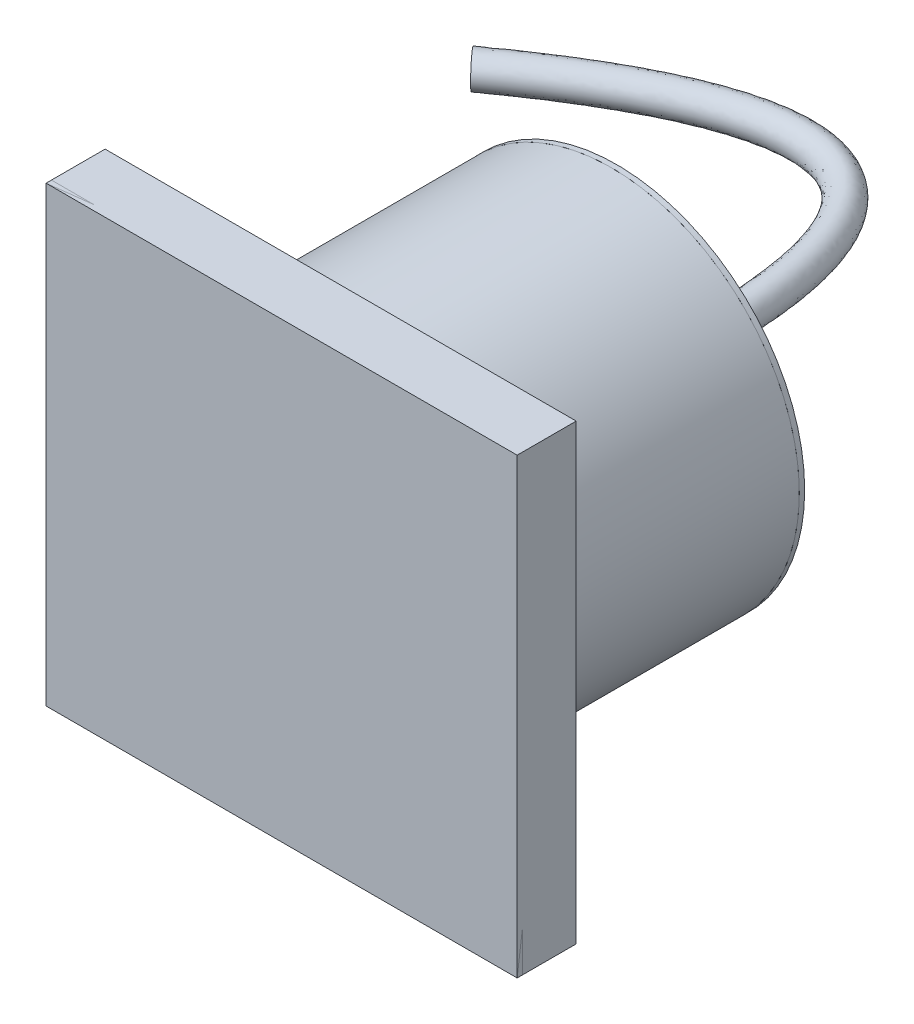
ISO-10303-21;
HEADER;
FILE_DESCRIPTION(('STEP AP214'),'2;1');
FILE_NAME('part.step','',(''),(''),'','','');
FILE_SCHEMA(('AUTOMOTIVE_DESIGN { 1 0 10303 214 1 1 1 1 }'));
ENDSEC;
DATA;
#1=APPLICATION_CONTEXT('core data for automotive mechanical design processes');
#2=APPLICATION_PROTOCOL_DEFINITION('international standard','automotive_design',2000,#1);
#3=PRODUCT_CONTEXT('',#1,'mechanical');
#4=PRODUCT('Part','Part','',(#3));
#5=PRODUCT_RELATED_PRODUCT_CATEGORY('part','',(#4));
#6=PRODUCT_DEFINITION_FORMATION('','',#4);
#7=PRODUCT_DEFINITION_CONTEXT('part definition',#1,'design');
#8=PRODUCT_DEFINITION('design','',#6,#7);
#9=PRODUCT_DEFINITION_SHAPE('','',#8);
#10=(LENGTH_UNIT() NAMED_UNIT(*) SI_UNIT(.MILLI.,.METRE.));
#11=(NAMED_UNIT(*) PLANE_ANGLE_UNIT() SI_UNIT($,.RADIAN.));
#12=(NAMED_UNIT(*) SI_UNIT($,.STERADIAN.) SOLID_ANGLE_UNIT());
#13=UNCERTAINTY_MEASURE_WITH_UNIT(LENGTH_MEASURE(1.E-05),#10,'distance_accuracy_value','');
#14=(GEOMETRIC_REPRESENTATION_CONTEXT(3) GLOBAL_UNCERTAINTY_ASSIGNED_CONTEXT((#13)) GLOBAL_UNIT_ASSIGNED_CONTEXT((#10,
#11,#12)) REPRESENTATION_CONTEXT('',''));
#15=CARTESIAN_POINT('',(0.,0.,0.));
#16=DIRECTION('',(0.,0.,1.));
#17=DIRECTION('',(1.,0.,0.));
#18=AXIS2_PLACEMENT_3D('',#15,#16,#17);
#19=CARTESIAN_POINT('',(0.,40.8338540584598,60.));
#20=DIRECTION('',(0.,1.,0.));
#21=DIRECTION('',(0.,0.,1.));
#22=AXIS2_PLACEMENT_3D('',#19,#20,#21);
#23=PLANE('',#22);
#24=DIRECTION('',(-1.,0.,0.));
#25=VECTOR('',#24,1.);
#26=CARTESIAN_POINT('',(0.,40.8338540584598,61.));
#27=LINE('',#26,#25);
#28=CARTESIAN_POINT('',(43.4301445007467,40.8338540584598,61.));
#29=VERTEX_POINT('',#28);
#30=CARTESIAN_POINT('',(-44.3402055413933,40.8338540584598,61.));
#31=VERTEX_POINT('',#30);
#32=EDGE_CURVE('E79',#29,#31,#27,.T.);
#33=ORIENTED_EDGE('',*,*,#32,.T.);
#34=DIRECTION('',(0.,0.,1.));
#35=VECTOR('',#34,1.);
#36=CARTESIAN_POINT('',(-44.3402055413933,40.8338540584598,60.));
#37=LINE('',#36,#35);
#38=CARTESIAN_POINT('',(-44.3402055413933,40.8338540584598,60.));
#39=VERTEX_POINT('',#38);
#40=EDGE_CURVE('E95',#39,#31,#37,.T.);
#41=ORIENTED_EDGE('',*,*,#40,.F.);
#42=DIRECTION('',(-1.,0.,0.));
#43=VECTOR('',#42,1.);
#44=CARTESIAN_POINT('',(0.,40.8338540584598,60.));
#45=LINE('',#44,#43);
#46=CARTESIAN_POINT('',(43.4301445007467,40.8338540584598,60.));
#47=VERTEX_POINT('',#46);
#48=EDGE_CURVE('E90',#47,#39,#45,.T.);
#49=ORIENTED_EDGE('',*,*,#48,.F.);
#50=DIRECTION('',(0.,0.,1.));
#51=VECTOR('',#50,1.);
#52=CARTESIAN_POINT('',(43.4301445007467,40.8338540584598,60.));
#53=LINE('',#52,#51);
#54=EDGE_CURVE('E113',#47,#29,#53,.T.);
#55=ORIENTED_EDGE('',*,*,#54,.T.);
#56=EDGE_LOOP('',(#33,#41,#49,#55));
#57=FACE_BOUND('',#56,.T.);
#58=ADVANCED_FACE('F46',(#57),#23,.F.);
#59=CARTESIAN_POINT('',(43.4301445007467,0.,60.));
#60=DIRECTION('',(1.,0.,0.));
#61=DIRECTION('',(0.,0.,-1.));
#62=AXIS2_PLACEMENT_3D('',#59,#60,#61);
#63=PLANE('',#62);
#64=DIRECTION('',(0.,1.,0.));
#65=VECTOR('',#64,1.);
#66=CARTESIAN_POINT('',(43.4301445007467,0.,61.));
#67=LINE('',#66,#65);
#68=CARTESIAN_POINT('',(43.4301445007467,-43.5261960842924,61.));
#69=VERTEX_POINT('',#68);
#70=EDGE_CURVE('E112',#69,#29,#67,.T.);
#71=ORIENTED_EDGE('',*,*,#70,.T.);
#72=ORIENTED_EDGE('',*,*,#54,.F.);
#73=DIRECTION('',(0.,1.,0.));
#74=VECTOR('',#73,1.);
#75=CARTESIAN_POINT('',(43.4301445007467,0.,60.));
#76=LINE('',#75,#74);
#77=CARTESIAN_POINT('',(43.4301445007467,-43.5261960842924,60.));
#78=VERTEX_POINT('',#77);
#79=EDGE_CURVE('E115',#78,#47,#76,.T.);
#80=ORIENTED_EDGE('',*,*,#79,.F.);
#81=DIRECTION('',(0.,0.,1.));
#82=VECTOR('',#81,1.);
#83=CARTESIAN_POINT('',(43.4301445007467,-43.5261960842924,60.));
#84=LINE('',#83,#82);
#85=EDGE_CURVE('E64',#78,#69,#84,.T.);
#86=ORIENTED_EDGE('',*,*,#85,.T.);
#87=EDGE_LOOP('',(#71,#72,#80,#86));
#88=FACE_BOUND('',#87,.T.);
#89=ADVANCED_FACE('F101',(#88),#63,.F.);
#90=CARTESIAN_POINT('',(-44.3402055413933,0.,60.));
#91=DIRECTION('',(1.,0.,0.));
#92=DIRECTION('',(0.,0.,-1.));
#93=AXIS2_PLACEMENT_3D('',#90,#91,#92);
#94=PLANE('',#93);
#95=DIRECTION('',(0.,1.,0.));
#96=VECTOR('',#95,1.);
#97=CARTESIAN_POINT('',(-44.3402055413933,0.,61.));
#98=LINE('',#97,#96);
#99=CARTESIAN_POINT('',(-44.3402055413933,-43.5261960842924,61.));
#100=VERTEX_POINT('',#99);
#101=EDGE_CURVE('E55',#100,#31,#98,.T.);
#102=ORIENTED_EDGE('',*,*,#101,.F.);
#103=DIRECTION('',(0.,0.,1.));
#104=VECTOR('',#103,1.);
#105=CARTESIAN_POINT('',(-44.3402055413933,-43.5261960842924,60.));
#106=LINE('',#105,#104);
#107=CARTESIAN_POINT('',(-44.3402055413933,-43.5261960842924,60.));
#108=VERTEX_POINT('',#107);
#109=EDGE_CURVE('E49',#108,#100,#106,.T.);
#110=ORIENTED_EDGE('',*,*,#109,.F.);
#111=DIRECTION('',(0.,1.,0.));
#112=VECTOR('',#111,1.);
#113=CARTESIAN_POINT('',(-44.3402055413933,0.,60.));
#114=LINE('',#113,#112);
#115=EDGE_CURVE('E12',#108,#39,#114,.T.);
#116=ORIENTED_EDGE('',*,*,#115,.T.);
#117=ORIENTED_EDGE('',*,*,#40,.T.);
#118=EDGE_LOOP('',(#102,#110,#116,#117));
#119=FACE_BOUND('',#118,.T.);
#120=ADVANCED_FACE('F47',(#119),#94,.T.);
#121=CARTESIAN_POINT('',(0.,-43.5261960842924,60.));
#122=DIRECTION('',(0.,1.,0.));
#123=DIRECTION('',(0.,0.,1.));
#124=AXIS2_PLACEMENT_3D('',#121,#122,#123);
#125=PLANE('',#124);
#126=DIRECTION('',(-1.,0.,0.));
#127=VECTOR('',#126,1.);
#128=CARTESIAN_POINT('',(0.,-43.5261960842924,61.));
#129=LINE('',#128,#127);
#130=EDGE_CURVE('E126',#69,#100,#129,.T.);
#131=ORIENTED_EDGE('',*,*,#130,.F.);
#132=ORIENTED_EDGE('',*,*,#85,.F.);
#133=DIRECTION('',(-1.,0.,0.));
#134=VECTOR('',#133,1.);
#135=CARTESIAN_POINT('',(0.,-43.5261960842924,60.));
#136=LINE('',#135,#134);
#137=EDGE_CURVE('E122',#78,#108,#136,.T.);
#138=ORIENTED_EDGE('',*,*,#137,.T.);
#139=ORIENTED_EDGE('',*,*,#109,.T.);
#140=EDGE_LOOP('',(#131,#132,#138,#139));
#141=FACE_BOUND('',#140,.T.);
#142=ADVANCED_FACE('F100',(#141),#125,.T.);
#143=OPEN_SHELL('',(#58,#89,#120,#142));
#144=SHELL_BASED_SURFACE_MODEL('B2',(#143));
#145=CARTESIAN_POINT('',(0.,0.,-1.00000000000003));
#146=DIRECTION('',(0.,0.,-1.));
#147=DIRECTION('',(-1.,0.,0.));
#148=AXIS2_PLACEMENT_3D('',#145,#146,#147);
#149=PLANE('',#148);
#150=CARTESIAN_POINT('',(0.,0.,-1.00000000000003));
#151=DIRECTION('',(0.,0.,-1.));
#152=DIRECTION('',(-1.,0.,0.));
#153=AXIS2_PLACEMENT_3D('',#150,#151,#152);
#154=CIRCLE('',#153,3.03948020865619);
#155=CARTESIAN_POINT('',(-3.03948020865619,0.,-1.00000000000003));
#156=VERTEX_POINT('',#155);
#157=EDGE_CURVE('E187',#156,#156,#154,.T.);
#158=ORIENTED_EDGE('',*,*,#157,.F.);
#159=EDGE_LOOP('',(#158));
#160=FACE_BOUND('',#159,.T.);
#161=ADVANCED_FACE('F180',(#160),#149,.F.);
#162=CARTESIAN_POINT('',(-63.8920106228567,0.,-37.9464076063486));
#163=DIRECTION('',(-0.755077393444624,0.,0.655635668575828));
#164=DIRECTION('',(0.655635668575828,0.,0.755077393444624));
#165=AXIS2_PLACEMENT_3D('',#162,#163,#164);
#166=PLANE('',#165);
#167=CARTESIAN_POINT('',(-63.8920106228567,0.,-37.9464076063486));
#168=DIRECTION('',(-0.755077393444624,0.,0.655635668575828));
#169=DIRECTION('',(0.655635668575828,0.,0.755077393444624));
#170=AXIS2_PLACEMENT_3D('',#167,#168,#169);
#171=CIRCLE('',#170,3.03948020865619);
#172=CARTESIAN_POINT('',(-61.8992189841314,0.,-35.65136481297));
#173=VERTEX_POINT('',#172);
#174=EDGE_CURVE('E44',#173,#173,#171,.T.);
#175=ORIENTED_EDGE('',*,*,#174,.T.);
#176=EDGE_LOOP('',(#175));
#177=FACE_BOUND('',#176,.T.);
#178=ADVANCED_FACE('F194',(#177),#166,.T.);
#179=CARTESIAN_POINT('',(-3.03948020865619,0.,-1.00000000000003));
#180=CARTESIAN_POINT('',(-1.70737719117019,0.,-15.6170926677153));
#181=CARTESIAN_POINT('',(-2.04746029327352,0.,-27.2336846526678));
#182=CARTESIAN_POINT('',(-4.81313357898193,0.,-39.9332320782309));
#183=CARTESIAN_POINT('',(-6.1043023358921,0.,-43.3693178575942));
#184=CARTESIAN_POINT('',(-9.26018383429651,0.,-48.6981614592624));
#185=CARTESIAN_POINT('',(-11.0979206715287,0.,-50.5955591511872));
#186=CARTESIAN_POINT('',(-15.4147863723169,0.,-53.2068062728214));
#187=CARTESIAN_POINT('',(-17.9372905064276,0.,-53.9421751270621));
#188=CARTESIAN_POINT('',(-24.0678429876786,0.,-54.1480106071399));
#189=CARTESIAN_POINT('',(-27.6629687479242,0.,-53.5937027347451));
#190=CARTESIAN_POINT('',(-39.9395832706852,0.,-49.7136099875802));
#191=CARTESIAN_POINT('',(-50.0637407778654,0.,-44.1746569322838));
#192=CARTESIAN_POINT('',(-61.8992189841314,0.,-35.65136481297));
#193=CARTESIAN_POINT('',(-3.03948020865619,6.07896041731237,-1.00000000000003));
#194=CARTESIAN_POINT('',(-1.70737719117019,6.07896041731237,-15.6170926677153));
#195=CARTESIAN_POINT('',(-2.04746029327352,6.07896041731237,-27.2336846526678));
#196=CARTESIAN_POINT('',(-4.81313357898193,6.07896041731237,-39.9332320782309));
#197=CARTESIAN_POINT('',(-6.1043023358921,6.07896041731237,-43.3693178575942));
#198=CARTESIAN_POINT('',(-9.26018383429651,6.07896041731237,-48.6981614592624));
#199=CARTESIAN_POINT('',(-11.0979206715287,6.07896041731237,-50.5955591511872));
#200=CARTESIAN_POINT('',(-15.4147863723169,6.07896041731237,-53.2068062728214));
#201=CARTESIAN_POINT('',(-17.9372905064276,6.07896041731237,-53.9421751270621));
#202=CARTESIAN_POINT('',(-24.0678429876786,6.07896041731237,-54.1480106071399));
#203=CARTESIAN_POINT('',(-27.6629687479242,6.07896041731237,-53.5937027347451));
#204=CARTESIAN_POINT('',(-39.9395832706852,6.07896041731237,-49.7136099875802));
#205=CARTESIAN_POINT('',(-50.0637407778654,6.07896041731237,-44.1746569322838));
#206=CARTESIAN_POINT('',(-61.8992189841314,6.07896041731237,-35.65136481297));
#207=CARTESIAN_POINT('',(3.03948020865619,6.07896041731237,-1.00000000000003));
#208=CARTESIAN_POINT('',(4.37158322618087,6.07896041731237,-15.9972777856035));
#209=CARTESIAN_POINT('',(4.04765374529039,6.07896041731237,-28.1308972907844));
#210=CARTESIAN_POINT('',(0.824980229416077,6.07896041731237,-42.2604286560842));
#211=CARTESIAN_POINT('',(-0.712021268712532,6.07896041731237,-46.3013293995007));
#212=CARTESIAN_POINT('',(-4.87658958940872,6.07896041731237,-52.9943793619651));
#213=CARTESIAN_POINT('',(-7.53113231624329,6.07896041731237,-55.6418887113774));
#214=CARTESIAN_POINT('',(-13.8629350525843,6.07896041731237,-59.1883761906974));
#215=CARTESIAN_POINT('',(-17.4968197915832,6.07896041731237,-60.0658348962759));
#216=CARTESIAN_POINT('',(-25.3431543654772,6.07896041731237,-60.1535750541932));
#217=CARTESIAN_POINT('',(-29.5685267873941,6.07896041731237,-59.388631004784));
#218=CARTESIAN_POINT('',(-43.2495707743631,6.07896041731237,-54.9128487644898));
#219=CARTESIAN_POINT('',(-53.7587375580245,6.07896041731237,-49.0170595317887));
#220=CARTESIAN_POINT('',(-65.884802261582,6.07896041731237,-40.2414503997273));
#221=CARTESIAN_POINT('',(3.03948020865619,0.,-1.00000000000003));
#222=CARTESIAN_POINT('',(4.37158322618087,0.,-15.9972777856035));
#223=CARTESIAN_POINT('',(4.0476537452894,0.,-28.1308972907844));
#224=CARTESIAN_POINT('',(0.824980229416574,0.,-42.2604286560842));
#225=CARTESIAN_POINT('',(-0.712021268712531,0.,-46.3013293995007));
#226=CARTESIAN_POINT('',(-4.87658958940872,0.,-52.9943793619651));
#227=CARTESIAN_POINT('',(-7.53113231624329,0.,-55.6418887113828));
#228=CARTESIAN_POINT('',(-13.8629350525843,0.,-59.1883761906921));
#229=CARTESIAN_POINT('',(-17.4968197915832,0.,-60.0658348962699));
#230=CARTESIAN_POINT('',(-25.3431543654772,0.,-60.1535750541993));
#231=CARTESIAN_POINT('',(-29.5685267873863,0.,-59.388631004784));
#232=CARTESIAN_POINT('',(-43.2495707743789,0.,-54.9128487644898));
#233=CARTESIAN_POINT('',(-53.7587375580245,0.,-49.0170595317887));
#234=CARTESIAN_POINT('',(-65.884802261582,0.,-40.2414503997273));
#235=CARTESIAN_POINT('',(3.03948020865619,-6.07896041731237,-1.00000000000003));
#236=CARTESIAN_POINT('',(4.37158322618087,-6.07896041731237,-15.9972777856035));
#237=CARTESIAN_POINT('',(4.04765374528841,-6.07896041731237,-28.1308972907844));
#238=CARTESIAN_POINT('',(0.824980229417072,-6.07896041731237,-42.2604286560842));
#239=CARTESIAN_POINT('',(-0.712021268712531,-6.07896041731237,-46.3013293995007));
#240=CARTESIAN_POINT('',(-4.87658958940872,-6.07896041731237,-52.9943793619651));
#241=CARTESIAN_POINT('',(-7.53113231624329,-6.07896041731237,-55.6418887113881));
#242=CARTESIAN_POINT('',(-13.8629350525843,-6.07896041731237,-59.1883761906868));
#243=CARTESIAN_POINT('',(-17.4968197915832,-6.07896041731237,-60.0658348962638));
#244=CARTESIAN_POINT('',(-25.3431543654772,-6.07896041731237,-60.1535750542053));
#245=CARTESIAN_POINT('',(-29.5685267873784,-6.07896041731237,-59.388631004784));
#246=CARTESIAN_POINT('',(-43.2495707743947,-6.07896041731237,-54.9128487644898));
#247=CARTESIAN_POINT('',(-53.7587375580245,-6.07896041731237,-49.0170595317887));
#248=CARTESIAN_POINT('',(-65.884802261582,-6.07896041731237,-40.2414503997273));
#249=CARTESIAN_POINT('',(-3.03948020865619,-6.07896041731237,-1.00000000000003));
#250=CARTESIAN_POINT('',(-1.70737719117019,-6.07896041731237,-15.6170926677153));
#251=CARTESIAN_POINT('',(-2.04746029327352,-6.07896041731237,-27.2336846526678));
#252=CARTESIAN_POINT('',(-4.81313357898193,-6.07896041731237,-39.9332320782309));
#253=CARTESIAN_POINT('',(-6.1043023358921,-6.07896041731237,-43.3693178575942));
#254=CARTESIAN_POINT('',(-9.26018383429651,-6.07896041731237,-48.6981614592624));
#255=CARTESIAN_POINT('',(-11.0979206715287,-6.07896041731237,-50.5955591511872));
#256=CARTESIAN_POINT('',(-15.4147863723169,-6.07896041731237,-53.2068062728214));
#257=CARTESIAN_POINT('',(-17.9372905064276,-6.07896041731237,-53.9421751270621));
#258=CARTESIAN_POINT('',(-24.0678429876786,-6.07896041731237,-54.1480106071399));
#259=CARTESIAN_POINT('',(-27.6629687479242,-6.07896041731237,-53.5937027347451));
#260=CARTESIAN_POINT('',(-39.9395832706852,-6.07896041731237,-49.7136099875802));
#261=CARTESIAN_POINT('',(-50.0637407778654,-6.07896041731237,-44.1746569322838));
#262=CARTESIAN_POINT('',(-61.8992189841314,-6.07896041731237,-35.65136481297));
#263=CARTESIAN_POINT('',(-3.03948020865619,0.,-1.00000000000003));
#264=CARTESIAN_POINT('',(-1.70737719117019,0.,-15.6170926677153));
#265=CARTESIAN_POINT('',(-2.04746029327352,0.,-27.2336846526678));
#266=CARTESIAN_POINT('',(-4.81313357898193,0.,-39.9332320782309));
#267=CARTESIAN_POINT('',(-6.1043023358921,0.,-43.3693178575942));
#268=CARTESIAN_POINT('',(-9.26018383429651,0.,-48.6981614592624));
#269=CARTESIAN_POINT('',(-11.0979206715287,0.,-50.5955591511872));
#270=CARTESIAN_POINT('',(-15.4147863723169,0.,-53.2068062728214));
#271=CARTESIAN_POINT('',(-17.9372905064276,0.,-53.9421751270621));
#272=CARTESIAN_POINT('',(-24.0678429876786,0.,-54.1480106071399));
#273=CARTESIAN_POINT('',(-27.6629687479242,0.,-53.5937027347451));
#274=CARTESIAN_POINT('',(-39.9395832706852,0.,-49.7136099875802));
#275=CARTESIAN_POINT('',(-50.0637407778654,0.,-44.1746569322838));
#276=CARTESIAN_POINT('',(-61.8992189841314,0.,-35.65136481297));
#277=(BOUNDED_SURFACE() B_SPLINE_SURFACE(3,3,((#179,#180,#181,#182,#183,#184,#185,#186,#187,
#188,#189,#190,#191,#192),(#193,#194,#195,#196,#197,#198,#199,#200,#201,#202,#203,#204,#205,
#206),(#207,#208,#209,#210,#211,#212,#213,#214,#215,#216,#217,#218,#219,#220),(#221,#222,#223,
#224,#225,#226,#227,#228,#229,#230,#231,#232,#233,#234),(#235,#236,#237,#238,#239,#240,#241,
#242,#243,#244,#245,#246,#247,#248),(#249,#250,#251,#252,#253,#254,#255,#256,#257,#258,#259,
#260,#261,#262),(#263,#264,#265,#266,#267,#268,#269,#270,#271,#272,#273,#274,#275,#276)),
.UNSPECIFIED.,.T.,.F.,.F.) B_SPLINE_SURFACE_WITH_KNOTS((4,3,4),(4,2,2,2,2,2,4),(0.,0.5,1.),(0.,
0.25,0.375,0.5,0.625,0.75,1.),
.UNSPECIFIED.) GEOMETRIC_REPRESENTATION_ITEM() RATIONAL_B_SPLINE_SURFACE(((1.,1.,1.,1.,1.,1.,1.,
1.,1.,1.,1.,1.,1.,1.),(0.333333333333333,0.333333333333333,0.333333333333333,0.333333333333333,
0.333333333333333,0.333333333333333,0.333333333333333,0.333333333333333,0.333333333333333,
0.333333333333333,0.333333333333333,0.333333333333333,0.333333333333333,0.333333333333333),
(0.333333333333333,0.333333333333333,0.333333333333333,0.333333333333333,0.333333333333333,
0.333333333333333,0.333333333333333,0.333333333333333,0.333333333333333,0.333333333333333,
0.333333333333333,0.333333333333333,0.333333333333333,0.333333333333333),(1.,1.,1.,1.,1.,1.,1.,
1.,1.,1.,1.,1.,1.,1.),(0.333333333333333,0.333333333333333,0.333333333333333,0.333333333333333,
0.333333333333333,0.333333333333333,0.333333333333333,0.333333333333333,0.333333333333333,
0.333333333333333,0.333333333333333,0.333333333333333,0.333333333333333,0.333333333333333),
(0.333333333333333,0.333333333333333,0.333333333333333,0.333333333333333,0.333333333333333,
0.333333333333333,0.333333333333333,0.333333333333333,0.333333333333333,0.333333333333333,
0.333333333333333,0.333333333333333,0.333333333333333,0.333333333333333),(1.,1.,1.,1.,1.,1.,1.,
1.,1.,1.,1.,1.,1.,1.))) REPRESENTATION_ITEM('') SURFACE());
#278=ORIENTED_EDGE('',*,*,#174,.F.);
#279=EDGE_LOOP('',(#278));
#280=FACE_BOUND('',#279,.T.);
#281=ORIENTED_EDGE('',*,*,#157,.T.);
#282=EDGE_LOOP('',(#281));
#283=FACE_BOUND('',#282,.T.);
#284=ADVANCED_FACE('F196',(#280,#283),#277,.T.);
#285=CLOSED_SHELL('',(#161,#178,#284));
#286=MANIFOLD_SOLID_BREP('B6',#285);
#287=CARTESIAN_POINT('',(0.,0.,-1.00000000000003));
#288=DIRECTION('',(0.,0.,1.));
#289=DIRECTION('',(1.,0.,0.));
#290=AXIS2_PLACEMENT_3D('',#287,#288,#289);
#291=CYLINDRICAL_SURFACE('',#290,35.);
#292=CARTESIAN_POINT('',(0.,0.,-1.00000000000003));
#293=DIRECTION('',(0.,0.,1.));
#294=DIRECTION('',(1.,0.,0.));
#295=AXIS2_PLACEMENT_3D('',#292,#293,#294);
#296=CIRCLE('',#295,35.);
#297=CARTESIAN_POINT('',(35.,0.,-1.00000000000003));
#298=VERTEX_POINT('',#297);
#299=EDGE_CURVE('E179',#298,#298,#296,.T.);
#300=ORIENTED_EDGE('',*,*,#299,.T.);
#301=EDGE_LOOP('',(#300));
#302=FACE_BOUND('',#301,.T.);
#303=CARTESIAN_POINT('',(0.,0.,0.));
#304=DIRECTION('',(0.,0.,1.));
#305=DIRECTION('',(1.,0.,0.));
#306=AXIS2_PLACEMENT_3D('',#303,#304,#305);
#307=CIRCLE('',#306,35.);
#308=CARTESIAN_POINT('',(35.,0.,0.));
#309=VERTEX_POINT('',#308);
#310=EDGE_CURVE('E241',#309,#309,#307,.T.);
#311=ORIENTED_EDGE('',*,*,#310,.F.);
#312=EDGE_LOOP('',(#311));
#313=FACE_BOUND('',#312,.T.);
#314=ADVANCED_FACE('F239',(#302,#313),#291,.T.);
#315=CARTESIAN_POINT('',(0.,0.,-1.00000000000003));
#316=DIRECTION('',(0.,0.,1.));
#317=DIRECTION('',(1.,0.,0.));
#318=AXIS2_PLACEMENT_3D('',#315,#316,#317);
#319=PLANE('',#318);
#320=ORIENTED_EDGE('',*,*,#299,.F.);
#321=EDGE_LOOP('',(#320));
#322=FACE_BOUND('',#321,.T.);
#323=ADVANCED_FACE('F253',(#322),#319,.F.);
#324=OPEN_SHELL('',(#314,#323));
#325=SHELL_BASED_SURFACE_MODEL('B38',(#324));
#326=CARTESIAN_POINT('',(0.,0.,61.));
#327=DIRECTION('',(0.,0.,-1.));
#328=DIRECTION('',(-1.,0.,0.));
#329=AXIS2_PLACEMENT_3D('',#326,#327,#328);
#330=CYLINDRICAL_SURFACE('',#329,25.);
#331=CARTESIAN_POINT('',(0.,0.,0.));
#332=DIRECTION('',(0.,0.,1.));
#333=DIRECTION('',(1.,0.,0.));
#334=AXIS2_PLACEMENT_3D('',#331,#332,#333);
#335=CIRCLE('',#334,25.);
#336=CARTESIAN_POINT('',(-25.,0.,0.));
#337=VERTEX_POINT('',#336);
#338=EDGE_CURVE('E322',#337,#337,#335,.T.);
#339=CARTESIAN_POINT('',(0.,0.,60.));
#340=DIRECTION('',(0.,0.,1.));
#341=DIRECTION('',(1.,0.,0.));
#342=AXIS2_PLACEMENT_3D('',#339,#340,#341);
#343=CIRCLE('',#342,25.);
#344=CARTESIAN_POINT('',(-25.,0.,60.));
#345=VERTEX_POINT('',#344);
#346=EDGE_CURVE('E341',#345,#345,#343,.T.);
#347=CARTESIAN_POINT('',(-25.,0.,0.));
#348=CARTESIAN_POINT('',(-25.,0.,0.624999999999994));
#349=CARTESIAN_POINT('',(-25.,0.,1.24999999999999));
#350=CARTESIAN_POINT('',(-25.,0.,2.5));
#351=CARTESIAN_POINT('',(-25.,0.,3.125));
#352=CARTESIAN_POINT('',(-25.,0.,4.375));
#353=CARTESIAN_POINT('',(-25.,0.,5.));
#354=CARTESIAN_POINT('',(-25.,0.,6.25));
#355=CARTESIAN_POINT('',(-25.,0.,6.87499999999999));
#356=CARTESIAN_POINT('',(-25.,0.,8.12499999999999));
#357=CARTESIAN_POINT('',(-25.,0.,8.74999999999999));
#358=CARTESIAN_POINT('',(-25.,0.,9.99999999999999));
#359=CARTESIAN_POINT('',(-25.,0.,10.625));
#360=CARTESIAN_POINT('',(-25.,0.,11.875));
#361=CARTESIAN_POINT('',(-25.,0.,12.5));
#362=CARTESIAN_POINT('',(-25.,0.,13.75));
#363=CARTESIAN_POINT('',(-25.,0.,14.375));
#364=CARTESIAN_POINT('',(-25.,0.,15.625));
#365=CARTESIAN_POINT('',(-25.,0.,16.25));
#366=CARTESIAN_POINT('',(-25.,0.,17.5));
#367=CARTESIAN_POINT('',(-25.,0.,18.125));
#368=CARTESIAN_POINT('',(-25.,0.,19.375));
#369=CARTESIAN_POINT('',(-25.,0.,20.));
#370=CARTESIAN_POINT('',(-25.,0.,21.25));
#371=CARTESIAN_POINT('',(-25.,0.,21.875));
#372=CARTESIAN_POINT('',(-25.,0.,23.125));
#373=CARTESIAN_POINT('',(-25.,0.,23.75));
#374=CARTESIAN_POINT('',(-25.,0.,25.));
#375=CARTESIAN_POINT('',(-25.,0.,25.625));
#376=CARTESIAN_POINT('',(-25.,0.,26.875));
#377=CARTESIAN_POINT('',(-25.,0.,27.5));
#378=CARTESIAN_POINT('',(-25.,0.,28.75));
#379=CARTESIAN_POINT('',(-25.,0.,29.375));
#380=CARTESIAN_POINT('',(-25.,0.,30.625));
#381=CARTESIAN_POINT('',(-25.,0.,31.25));
#382=CARTESIAN_POINT('',(-25.,0.,32.5));
#383=CARTESIAN_POINT('',(-25.,0.,33.125));
#384=CARTESIAN_POINT('',(-25.,0.,34.375));
#385=CARTESIAN_POINT('',(-25.,0.,35.));
#386=CARTESIAN_POINT('',(-25.,0.,36.25));
#387=CARTESIAN_POINT('',(-25.,0.,36.875));
#388=CARTESIAN_POINT('',(-25.,0.,38.125));
#389=CARTESIAN_POINT('',(-25.,0.,38.75));
#390=CARTESIAN_POINT('',(-25.,0.,40.));
#391=CARTESIAN_POINT('',(-25.,0.,40.625));
#392=CARTESIAN_POINT('',(-25.,0.,41.875));
#393=CARTESIAN_POINT('',(-25.,0.,42.5));
#394=CARTESIAN_POINT('',(-25.,0.,43.75));
#395=CARTESIAN_POINT('',(-25.,0.,44.375));
#396=CARTESIAN_POINT('',(-25.,0.,45.625));
#397=CARTESIAN_POINT('',(-25.,0.,46.25));
#398=CARTESIAN_POINT('',(-25.,0.,47.5));
#399=CARTESIAN_POINT('',(-25.,0.,48.125));
#400=CARTESIAN_POINT('',(-25.,0.,49.375));
#401=CARTESIAN_POINT('',(-25.,0.,50.));
#402=CARTESIAN_POINT('',(-25.,0.,51.25));
#403=CARTESIAN_POINT('',(-25.,0.,51.875));
#404=CARTESIAN_POINT('',(-25.,0.,53.125));
#405=CARTESIAN_POINT('',(-25.,0.,53.75));
#406=CARTESIAN_POINT('',(-25.,0.,55.));
#407=CARTESIAN_POINT('',(-25.,0.,55.625));
#408=CARTESIAN_POINT('',(-25.,0.,56.875));
#409=CARTESIAN_POINT('',(-25.,0.,57.5));
#410=CARTESIAN_POINT('',(-25.,0.,58.75));
#411=CARTESIAN_POINT('',(-25.,0.,59.375));
#412=CARTESIAN_POINT('',(-25.,0.,60.));
#413=B_SPLINE_CURVE_WITH_KNOTS('',3,(#347,#348,#349,#350,#351,#352,#353,#354,#355,#356,#357,
#358,#359,#360,#361,#362,#363,#364,#365,#366,#367,#368,#369,#370,#371,#372,#373,#374,#375,#376,
#377,#378,#379,#380,#381,#382,#383,#384,#385,#386,#387,#388,#389,#390,#391,#392,#393,#394,#395,
#396,#397,#398,#399,#400,#401,#402,#403,#404,#405,#406,#407,#408,#409,#410,#411,#412),
.UNSPECIFIED.,.F.,.F.,(4,2,2,2,2,2,2,2,2,2,2,2,2,2,2,2,2,2,2,2,2,2,2,2,2,2,2,2,2,2,2,2,4),(0.,
1.875,3.75,5.62500000000001,7.5,9.375,11.25,13.125,15.,16.875,18.75,20.625,22.5,24.375,26.25,
28.125,30.,31.875,33.75,35.625,37.5,39.375,41.25,43.125,45.,46.875,48.75,50.625,52.5,54.375,
56.25,58.125,60.),.UNSPECIFIED.);
#414=EDGE_CURVE('BSEAM271',#337,#345,#413,.T.);
#415=ORIENTED_EDGE('',*,*,#338,.F.);
#416=ORIENTED_EDGE('',*,*,#346,.T.);
#417=ORIENTED_EDGE('',*,*,#414,.T.);
#418=ORIENTED_EDGE('',*,*,#414,.F.);
#419=EDGE_LOOP('',(#415,#417,#416,#418));
#420=FACE_BOUND('',#419,.T.);
#421=ADVANCED_FACE('F271',(#420),#330,.F.);
#422=CARTESIAN_POINT('',(0.,0.,61.));
#423=DIRECTION('',(0.,0.,-1.));
#424=DIRECTION('',(-1.,0.,0.));
#425=AXIS2_PLACEMENT_3D('',#422,#423,#424);
#426=CYLINDRICAL_SURFACE('',#425,35.);
#427=CARTESIAN_POINT('',(0.,0.,0.));
#428=DIRECTION('',(0.,0.,1.));
#429=DIRECTION('',(1.,0.,0.));
#430=AXIS2_PLACEMENT_3D('',#427,#428,#429);
#431=CIRCLE('',#430,35.);
#432=CARTESIAN_POINT('',(-35.,0.,0.));
#433=VERTEX_POINT('',#432);
#434=EDGE_CURVE('E279',#433,#433,#431,.T.);
#435=CARTESIAN_POINT('',(0.,0.,50.));
#436=DIRECTION('',(0.,0.,1.));
#437=DIRECTION('',(1.,0.,0.));
#438=AXIS2_PLACEMENT_3D('',#435,#436,#437);
#439=CIRCLE('',#438,35.);
#440=CARTESIAN_POINT('',(-35.,0.,50.));
#441=VERTEX_POINT('',#440);
#442=EDGE_CURVE('E237',#441,#441,#439,.T.);
#443=CARTESIAN_POINT('',(-35.,0.,0.));
#444=CARTESIAN_POINT('',(-35.,0.,0.520833333333327));
#445=CARTESIAN_POINT('',(-35.,0.,1.04166666666666));
#446=CARTESIAN_POINT('',(-35.,0.,2.08333333333333));
#447=CARTESIAN_POINT('',(-35.,0.,2.60416666666666));
#448=CARTESIAN_POINT('',(-35.,0.,3.64583333333333));
#449=CARTESIAN_POINT('',(-35.,0.,4.16666666666666));
#450=CARTESIAN_POINT('',(-35.,0.,5.20833333333332));
#451=CARTESIAN_POINT('',(-35.,0.,5.72916666666666));
#452=CARTESIAN_POINT('',(-35.,0.,6.77083333333333));
#453=CARTESIAN_POINT('',(-35.,0.,7.29166666666666));
#454=CARTESIAN_POINT('',(-35.,0.,8.33333333333333));
#455=CARTESIAN_POINT('',(-35.,0.,8.85416666666666));
#456=CARTESIAN_POINT('',(-35.,0.,9.89583333333333));
#457=CARTESIAN_POINT('',(-35.,0.,10.4166666666667));
#458=CARTESIAN_POINT('',(-35.,0.,11.4583333333333));
#459=CARTESIAN_POINT('',(-35.,0.,11.9791666666667));
#460=CARTESIAN_POINT('',(-35.,0.,13.0208333333333));
#461=CARTESIAN_POINT('',(-35.,0.,13.5416666666667));
#462=CARTESIAN_POINT('',(-35.,0.,14.5833333333333));
#463=CARTESIAN_POINT('',(-35.,0.,15.1041666666667));
#464=CARTESIAN_POINT('',(-35.,0.,16.1458333333333));
#465=CARTESIAN_POINT('',(-35.,0.,16.6666666666667));
#466=CARTESIAN_POINT('',(-35.,0.,17.7083333333333));
#467=CARTESIAN_POINT('',(-35.,0.,18.2291666666667));
#468=CARTESIAN_POINT('',(-35.,0.,19.2708333333333));
#469=CARTESIAN_POINT('',(-35.,0.,19.7916666666667));
#470=CARTESIAN_POINT('',(-35.,0.,20.8333333333333));
#471=CARTESIAN_POINT('',(-35.,0.,21.3541666666667));
#472=CARTESIAN_POINT('',(-35.,0.,22.3958333333333));
#473=CARTESIAN_POINT('',(-35.,0.,22.9166666666667));
#474=CARTESIAN_POINT('',(-35.,0.,23.9583333333333));
#475=CARTESIAN_POINT('',(-35.,0.,24.4791666666667));
#476=CARTESIAN_POINT('',(-35.,0.,25.5208333333333));
#477=CARTESIAN_POINT('',(-35.,0.,26.0416666666667));
#478=CARTESIAN_POINT('',(-35.,0.,27.0833333333333));
#479=CARTESIAN_POINT('',(-35.,0.,27.6041666666667));
#480=CARTESIAN_POINT('',(-35.,0.,28.6458333333333));
#481=CARTESIAN_POINT('',(-35.,0.,29.1666666666667));
#482=CARTESIAN_POINT('',(-35.,0.,30.2083333333333));
#483=CARTESIAN_POINT('',(-35.,0.,30.7291666666667));
#484=CARTESIAN_POINT('',(-35.,0.,31.7708333333333));
#485=CARTESIAN_POINT('',(-35.,0.,32.2916666666667));
#486=CARTESIAN_POINT('',(-35.,0.,33.3333333333333));
#487=CARTESIAN_POINT('',(-35.,0.,33.8541666666667));
#488=CARTESIAN_POINT('',(-35.,0.,34.8958333333333));
#489=CARTESIAN_POINT('',(-35.,0.,35.4166666666667));
#490=CARTESIAN_POINT('',(-35.,0.,36.4583333333333));
#491=CARTESIAN_POINT('',(-35.,0.,36.9791666666667));
#492=CARTESIAN_POINT('',(-35.,0.,38.0208333333333));
#493=CARTESIAN_POINT('',(-35.,0.,38.5416666666667));
#494=CARTESIAN_POINT('',(-35.,0.,39.5833333333333));
#495=CARTESIAN_POINT('',(-35.,0.,40.1041666666667));
#496=CARTESIAN_POINT('',(-35.,0.,41.1458333333333));
#497=CARTESIAN_POINT('',(-35.,0.,41.6666666666667));
#498=CARTESIAN_POINT('',(-35.,0.,42.7083333333333));
#499=CARTESIAN_POINT('',(-35.,0.,43.2291666666667));
#500=CARTESIAN_POINT('',(-35.,0.,44.2708333333333));
#501=CARTESIAN_POINT('',(-35.,0.,44.7916666666667));
#502=CARTESIAN_POINT('',(-35.,0.,45.8333333333333));
#503=CARTESIAN_POINT('',(-35.,0.,46.3541666666667));
#504=CARTESIAN_POINT('',(-35.,0.,47.3958333333333));
#505=CARTESIAN_POINT('',(-35.,0.,47.9166666666667));
#506=CARTESIAN_POINT('',(-35.,0.,48.9583333333333));
#507=CARTESIAN_POINT('',(-35.,0.,49.4791666666667));
#508=CARTESIAN_POINT('',(-35.,0.,50.));
#509=B_SPLINE_CURVE_WITH_KNOTS('',3,(#443,#444,#445,#446,#447,#448,#449,#450,#451,#452,#453,
#454,#455,#456,#457,#458,#459,#460,#461,#462,#463,#464,#465,#466,#467,#468,#469,#470,#471,#472,
#473,#474,#475,#476,#477,#478,#479,#480,#481,#482,#483,#484,#485,#486,#487,#488,#489,#490,#491,
#492,#493,#494,#495,#496,#497,#498,#499,#500,#501,#502,#503,#504,#505,#506,#507,#508),
.UNSPECIFIED.,.F.,.F.,(4,2,2,2,2,2,2,2,2,2,2,2,2,2,2,2,2,2,2,2,2,2,2,2,2,2,2,2,2,2,2,2,4),(0.,
1.5625,3.125,4.6875,6.25,7.8125,9.375,10.9375,12.5,14.0625,15.625,17.1875,18.75,20.3125,21.875,
23.4375,25.,26.5625,28.125,29.6875,31.25,32.8125,34.375,35.9375,37.5,39.0625,40.625,42.1875,
43.75,45.3125,46.875,48.4375,50.),.UNSPECIFIED.);
#510=EDGE_CURVE('BSEAM273',#433,#441,#509,.T.);
#511=ORIENTED_EDGE('',*,*,#434,.T.);
#512=ORIENTED_EDGE('',*,*,#442,.F.);
#513=ORIENTED_EDGE('',*,*,#510,.T.);
#514=ORIENTED_EDGE('',*,*,#510,.F.);
#515=EDGE_LOOP('',(#511,#513,#512,#514));
#516=FACE_BOUND('',#515,.T.);
#517=ADVANCED_FACE('F273',(#516),#426,.T.);
#518=CARTESIAN_POINT('',(0.,0.,0.));
#519=DIRECTION('',(0.,0.,1.));
#520=DIRECTION('',(1.,0.,0.));
#521=AXIS2_PLACEMENT_3D('',#518,#519,#520);
#522=PLANE('',#521);
#523=ORIENTED_EDGE('',*,*,#434,.F.);
#524=EDGE_LOOP('',(#523));
#525=FACE_BOUND('',#524,.T.);
#526=ORIENTED_EDGE('',*,*,#338,.T.);
#527=EDGE_LOOP('',(#526));
#528=FACE_BOUND('',#527,.T.);
#529=ADVANCED_FACE('F360',(#525,#528),#522,.F.);
#530=CARTESIAN_POINT('',(0.,0.,50.));
#531=DIRECTION('',(0.,0.,1.));
#532=DIRECTION('',(1.,0.,0.));
#533=AXIS2_PLACEMENT_3D('',#530,#531,#532);
#534=PLANE('',#533);
#535=DIRECTION('',(0.,-1.,0.));
#536=VECTOR('',#535,1.);
#537=CARTESIAN_POINT('',(-44.3402055413933,40.8338540584598,50.));
#538=LINE('',#537,#536);
#539=CARTESIAN_POINT('',(-44.3402055413933,40.8338540584598,50.));
#540=VERTEX_POINT('',#539);
#541=CARTESIAN_POINT('',(-44.3402055413933,-43.5261960842924,50.));
#542=VERTEX_POINT('',#541);
#543=EDGE_CURVE('E320',#540,#542,#538,.T.);
#544=ORIENTED_EDGE('',*,*,#543,.F.);
#545=DIRECTION('',(-1.,0.,0.));
#546=VECTOR('',#545,1.);
#547=CARTESIAN_POINT('',(-44.3402055413933,40.8338540584598,50.));
#548=LINE('',#547,#546);
#549=CARTESIAN_POINT('',(43.4301445007467,40.8338540584598,50.));
#550=VERTEX_POINT('',#549);
#551=EDGE_CURVE('E286',#550,#540,#548,.T.);
#552=ORIENTED_EDGE('',*,*,#551,.F.);
#553=DIRECTION('',(0.,1.,0.));
#554=VECTOR('',#553,1.);
#555=CARTESIAN_POINT('',(43.4301445007467,40.8338540584598,50.));
#556=LINE('',#555,#554);
#557=CARTESIAN_POINT('',(43.4301445007467,-43.5261960842924,50.));
#558=VERTEX_POINT('',#557);
#559=EDGE_CURVE('E294',#558,#550,#556,.T.);
#560=ORIENTED_EDGE('',*,*,#559,.F.);
#561=DIRECTION('',(1.,0.,0.));
#562=VECTOR('',#561,1.);
#563=CARTESIAN_POINT('',(-44.3402055413933,-43.5261960842924,50.));
#564=LINE('',#563,#562);
#565=EDGE_CURVE('E345',#542,#558,#564,.T.);
#566=ORIENTED_EDGE('',*,*,#565,.F.);
#567=EDGE_LOOP('',(#544,#552,#560,#566));
#568=FACE_BOUND('',#567,.T.);
#569=ORIENTED_EDGE('',*,*,#442,.T.);
#570=EDGE_LOOP('',(#569));
#571=FACE_BOUND('',#570,.T.);
#572=ADVANCED_FACE('F363',(#568,#571),#534,.F.);
#573=CARTESIAN_POINT('',(-44.3402055413933,40.8338540584598,60.));
#574=DIRECTION('',(1.,0.,0.));
#575=DIRECTION('',(0.,0.,-1.));
#576=AXIS2_PLACEMENT_3D('',#573,#574,#575);
#577=PLANE('',#576);
#578=ORIENTED_EDGE('',*,*,#543,.T.);
#579=DIRECTION('',(0.,0.,-1.));
#580=VECTOR('',#579,1.);
#581=CARTESIAN_POINT('',(-44.3402055413933,-43.5261960842924,60.));
#582=LINE('',#581,#580);
#583=CARTESIAN_POINT('',(-44.3402055413933,-43.5261960842924,61.));
#584=VERTEX_POINT('',#583);
#585=EDGE_CURVE('E314',#584,#542,#582,.T.);
#586=ORIENTED_EDGE('',*,*,#585,.F.);
#587=DIRECTION('',(0.,-1.,0.));
#588=VECTOR('',#587,1.);
#589=CARTESIAN_POINT('',(-44.3402055413933,40.8338540584598,61.));
#590=LINE('',#589,#588);
#591=CARTESIAN_POINT('',(-44.3402055413933,40.8338540584598,61.));
#592=VERTEX_POINT('',#591);
#593=EDGE_CURVE('E318',#592,#584,#590,.T.);
#594=ORIENTED_EDGE('',*,*,#593,.F.);
#595=DIRECTION('',(0.,0.,-1.));
#596=VECTOR('',#595,1.);
#597=CARTESIAN_POINT('',(-44.3402055413933,40.8338540584598,60.));
#598=LINE('',#597,#596);
#599=EDGE_CURVE('E349',#592,#540,#598,.T.);
#600=ORIENTED_EDGE('',*,*,#599,.T.);
#601=EDGE_LOOP('',(#578,#586,#594,#600));
#602=FACE_BOUND('',#601,.T.);
#603=ADVANCED_FACE('F316',(#602),#577,.F.);
#604=CARTESIAN_POINT('',(-44.3402055413933,-43.5261960842924,60.));
#605=DIRECTION('',(0.,1.,0.));
#606=DIRECTION('',(0.,0.,1.));
#607=AXIS2_PLACEMENT_3D('',#604,#605,#606);
#608=PLANE('',#607);
#609=ORIENTED_EDGE('',*,*,#565,.T.);
#610=DIRECTION('',(0.,0.,-1.));
#611=VECTOR('',#610,1.);
#612=CARTESIAN_POINT('',(43.4301445007467,-43.5261960842924,60.));
#613=LINE('',#612,#611);
#614=CARTESIAN_POINT('',(43.4301445007467,-43.5261960842924,61.));
#615=VERTEX_POINT('',#614);
#616=EDGE_CURVE('E323',#615,#558,#613,.T.);
#617=ORIENTED_EDGE('',*,*,#616,.F.);
#618=DIRECTION('',(1.,0.,0.));
#619=VECTOR('',#618,1.);
#620=CARTESIAN_POINT('',(-44.3402055413933,-43.5261960842924,61.));
#621=LINE('',#620,#619);
#622=EDGE_CURVE('E326',#584,#615,#621,.T.);
#623=ORIENTED_EDGE('',*,*,#622,.F.);
#624=ORIENTED_EDGE('',*,*,#585,.T.);
#625=EDGE_LOOP('',(#609,#617,#623,#624));
#626=FACE_BOUND('',#625,.T.);
#627=ADVANCED_FACE('F327',(#626),#608,.F.);
#628=CARTESIAN_POINT('',(43.4301445007467,40.8338540584598,60.));
#629=DIRECTION('',(-1.,0.,0.));
#630=DIRECTION('',(0.,0.,1.));
#631=AXIS2_PLACEMENT_3D('',#628,#629,#630);
#632=PLANE('',#631);
#633=ORIENTED_EDGE('',*,*,#559,.T.);
#634=DIRECTION('',(0.,0.,-1.));
#635=VECTOR('',#634,1.);
#636=CARTESIAN_POINT('',(43.4301445007467,40.8338540584598,60.));
#637=LINE('',#636,#635);
#638=CARTESIAN_POINT('',(43.4301445007467,40.8338540584598,61.));
#639=VERTEX_POINT('',#638);
#640=EDGE_CURVE('E351',#639,#550,#637,.T.);
#641=ORIENTED_EDGE('',*,*,#640,.F.);
#642=DIRECTION('',(0.,1.,0.));
#643=VECTOR('',#642,1.);
#644=CARTESIAN_POINT('',(43.4301445007467,40.8338540584598,61.));
#645=LINE('',#644,#643);
#646=EDGE_CURVE('E331',#615,#639,#645,.T.);
#647=ORIENTED_EDGE('',*,*,#646,.F.);
#648=ORIENTED_EDGE('',*,*,#616,.T.);
#649=EDGE_LOOP('',(#633,#641,#647,#648));
#650=FACE_BOUND('',#649,.T.);
#651=ADVANCED_FACE('F380',(#650),#632,.F.);
#652=CARTESIAN_POINT('',(-44.3402055413933,40.8338540584598,60.));
#653=DIRECTION('',(0.,-1.,0.));
#654=DIRECTION('',(0.,0.,-1.));
#655=AXIS2_PLACEMENT_3D('',#652,#653,#654);
#656=PLANE('',#655);
#657=ORIENTED_EDGE('',*,*,#551,.T.);
#658=ORIENTED_EDGE('',*,*,#599,.F.);
#659=DIRECTION('',(-1.,0.,0.));
#660=VECTOR('',#659,1.);
#661=CARTESIAN_POINT('',(-44.3402055413933,40.8338540584598,61.));
#662=LINE('',#661,#660);
#663=EDGE_CURVE('E336',#639,#592,#662,.T.);
#664=ORIENTED_EDGE('',*,*,#663,.F.);
#665=ORIENTED_EDGE('',*,*,#640,.T.);
#666=EDGE_LOOP('',(#657,#658,#664,#665));
#667=FACE_BOUND('',#666,.T.);
#668=ADVANCED_FACE('F373',(#667),#656,.F.);
#669=CARTESIAN_POINT('',(0.,0.,60.));
#670=DIRECTION('',(0.,0.,1.));
#671=DIRECTION('',(1.,0.,0.));
#672=AXIS2_PLACEMENT_3D('',#669,#670,#671);
#673=PLANE('',#672);
#674=ORIENTED_EDGE('',*,*,#346,.F.);
#675=EDGE_LOOP('',(#674));
#676=FACE_BOUND('',#675,.T.);
#677=ADVANCED_FACE('F371',(#676),#673,.F.);
#678=CARTESIAN_POINT('',(0.,0.,61.));
#679=DIRECTION('',(0.,0.,1.));
#680=DIRECTION('',(1.,0.,0.));
#681=AXIS2_PLACEMENT_3D('',#678,#679,#680);
#682=PLANE('',#681);
#683=ORIENTED_EDGE('',*,*,#593,.T.);
#684=ORIENTED_EDGE('',*,*,#622,.T.);
#685=ORIENTED_EDGE('',*,*,#646,.T.);
#686=ORIENTED_EDGE('',*,*,#663,.T.);
#687=EDGE_LOOP('',(#683,#684,#685,#686));
#688=FACE_BOUND('',#687,.T.);
#689=ADVANCED_FACE('F334',(#688),#682,.T.);
#690=CLOSED_SHELL('',(#421,#517,#529,#572,#603,#627,#651,#668,#677,#689));
#691=MANIFOLD_SOLID_BREP('B174',#690);
#692=ADVANCED_BREP_SHAPE_REPRESENTATION('',(#18,#286,#691),#14);
#693=MANIFOLD_SURFACE_SHAPE_REPRESENTATION('',(#18,#144,#325),#14);
#694=SHAPE_REPRESENTATION('',(#18),#14);
#695=SHAPE_DEFINITION_REPRESENTATION(#9,#694);
#696=SHAPE_REPRESENTATION_RELATIONSHIP('','',#694,#692);
#697=SHAPE_REPRESENTATION_RELATIONSHIP('','',#694,#693);
ENDSEC;
END-ISO-10303-21;
